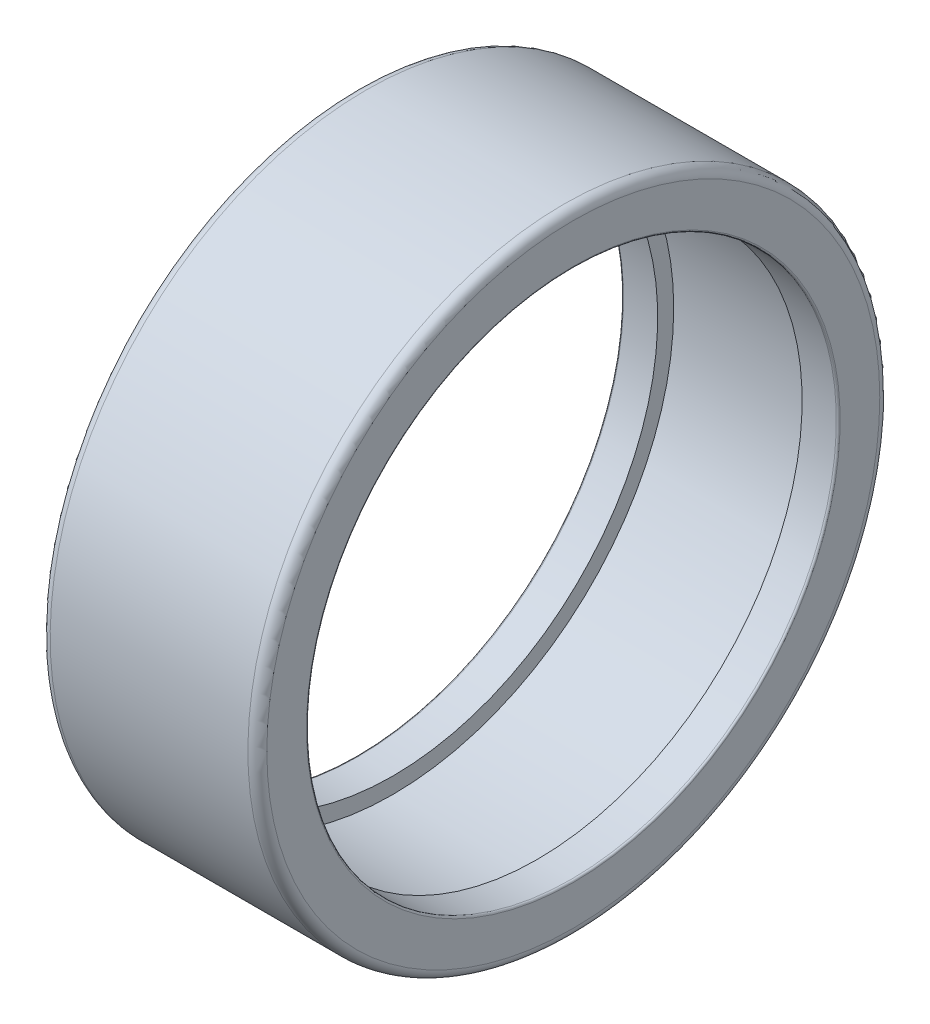
ISO-10303-21;
HEADER;
FILE_DESCRIPTION(('STEP AP214'),'2;1');
FILE_NAME('part.step','',(''),(''),'','','');
FILE_SCHEMA(('AUTOMOTIVE_DESIGN { 1 0 10303 214 1 1 1 1 }'));
ENDSEC;
DATA;
#1=APPLICATION_CONTEXT('core data for automotive mechanical design processes');
#2=APPLICATION_PROTOCOL_DEFINITION('international standard','automotive_design',2000,#1);
#3=PRODUCT_CONTEXT('',#1,'mechanical');
#4=PRODUCT('Part','Part','',(#3));
#5=PRODUCT_RELATED_PRODUCT_CATEGORY('part','',(#4));
#6=PRODUCT_DEFINITION_FORMATION('','',#4);
#7=PRODUCT_DEFINITION_CONTEXT('part definition',#1,'design');
#8=PRODUCT_DEFINITION('design','',#6,#7);
#9=PRODUCT_DEFINITION_SHAPE('','',#8);
#10=(LENGTH_UNIT() NAMED_UNIT(*) SI_UNIT(.MILLI.,.METRE.));
#11=(NAMED_UNIT(*) PLANE_ANGLE_UNIT() SI_UNIT($,.RADIAN.));
#12=(NAMED_UNIT(*) SI_UNIT($,.STERADIAN.) SOLID_ANGLE_UNIT());
#13=UNCERTAINTY_MEASURE_WITH_UNIT(LENGTH_MEASURE(1.E-05),#10,'distance_accuracy_value','');
#14=(GEOMETRIC_REPRESENTATION_CONTEXT(3) GLOBAL_UNCERTAINTY_ASSIGNED_CONTEXT((#13)) GLOBAL_UNIT_ASSIGNED_CONTEXT((#10,
#11,#12)) REPRESENTATION_CONTEXT('',''));
#15=CARTESIAN_POINT('',(0.,0.,0.));
#16=DIRECTION('',(0.,0.,1.));
#17=DIRECTION('',(1.,0.,0.));
#18=AXIS2_PLACEMENT_3D('',#15,#16,#17);
#19=CARTESIAN_POINT('',(47.58,0.,0.));
#20=DIRECTION('',(1.,0.,0.));
#21=DIRECTION('',(0.,0.,-1.));
#22=AXIS2_PLACEMENT_3D('',#19,#20,#21);
#23=TOROIDAL_SURFACE('',#22,59.12,0.42);
#24=CARTESIAN_POINT('',(48.,0.,0.));
#25=DIRECTION('',(1.,0.,0.));
#26=DIRECTION('',(0.,1.,0.));
#27=AXIS2_PLACEMENT_3D('',#24,#25,#26);
#28=CIRCLE('',#27,59.12);
#29=CARTESIAN_POINT('',(48.,59.12,0.));
#30=VERTEX_POINT('',#29);
#31=EDGE_CURVE('E11',#30,#30,#28,.T.);
#32=ORIENTED_EDGE('',*,*,#31,.T.);
#33=EDGE_LOOP('',(#32));
#34=FACE_BOUND('',#33,.T.);
#35=CARTESIAN_POINT('',(47.58,0.,0.));
#36=DIRECTION('',(1.,0.,0.));
#37=DIRECTION('',(0.,1.,0.));
#38=AXIS2_PLACEMENT_3D('',#35,#36,#37);
#39=CIRCLE('',#38,58.7);
#40=CARTESIAN_POINT('',(47.58,58.7,0.));
#41=VERTEX_POINT('',#40);
#42=EDGE_CURVE('E65',#41,#41,#39,.T.);
#43=ORIENTED_EDGE('',*,*,#42,.F.);
#44=EDGE_LOOP('',(#43));
#45=FACE_BOUND('',#44,.T.);
#46=ADVANCED_FACE('F19',(#34,#45),#23,.T.);
#47=CARTESIAN_POINT('',(48.,63.51,0.));
#48=DIRECTION('',(1.,0.,0.));
#49=DIRECTION('',(0.,1.,0.));
#50=AXIS2_PLACEMENT_3D('',#47,#48,#49);
#51=PLANE('',#50);
#52=CARTESIAN_POINT('',(48.,0.,0.));
#53=DIRECTION('',(1.,0.,0.));
#54=DIRECTION('',(0.,1.,0.));
#55=AXIS2_PLACEMENT_3D('',#52,#53,#54);
#56=CIRCLE('',#55,67.9);
#57=CARTESIAN_POINT('',(48.,67.9,0.));
#58=VERTEX_POINT('',#57);
#59=EDGE_CURVE('E29',#58,#58,#56,.T.);
#60=ORIENTED_EDGE('',*,*,#59,.T.);
#61=EDGE_LOOP('',(#60));
#62=FACE_BOUND('',#61,.T.);
#63=ORIENTED_EDGE('',*,*,#31,.F.);
#64=EDGE_LOOP('',(#63));
#65=FACE_BOUND('',#64,.T.);
#66=ADVANCED_FACE('F110',(#62,#65),#51,.T.);
#67=CARTESIAN_POINT('',(45.9,0.,0.));
#68=DIRECTION('',(1.,0.,0.));
#69=DIRECTION('',(0.,0.,-1.));
#70=AXIS2_PLACEMENT_3D('',#67,#68,#69);
#71=TOROIDAL_SURFACE('',#70,67.9,2.1);
#72=CARTESIAN_POINT('',(45.9,0.,0.));
#73=DIRECTION('',(1.,0.,0.));
#74=DIRECTION('',(0.,1.,0.));
#75=AXIS2_PLACEMENT_3D('',#72,#73,#74);
#76=CIRCLE('',#75,70.);
#77=CARTESIAN_POINT('',(45.9,70.,0.));
#78=VERTEX_POINT('',#77);
#79=EDGE_CURVE('E79',#78,#78,#76,.T.);
#80=ORIENTED_EDGE('',*,*,#79,.T.);
#81=EDGE_LOOP('',(#80));
#82=FACE_BOUND('',#81,.T.);
#83=ORIENTED_EDGE('',*,*,#59,.F.);
#84=EDGE_LOOP('',(#83));
#85=FACE_BOUND('',#84,.T.);
#86=ADVANCED_FACE('F114',(#82,#85),#71,.T.);
#87=CARTESIAN_POINT('',(24.,0.,0.));
#88=DIRECTION('',(-1.,0.,0.));
#89=DIRECTION('',(0.,1.,0.));
#90=AXIS2_PLACEMENT_3D('',#87,#88,#89);
#91=CYLINDRICAL_SURFACE('',#90,70.);
#92=CARTESIAN_POINT('',(2.1,0.,0.));
#93=DIRECTION('',(1.,0.,0.));
#94=DIRECTION('',(0.,1.,0.));
#95=AXIS2_PLACEMENT_3D('',#92,#93,#94);
#96=CIRCLE('',#95,70.);
#97=CARTESIAN_POINT('',(2.1,70.,0.));
#98=VERTEX_POINT('',#97);
#99=EDGE_CURVE('E78',#98,#98,#96,.T.);
#100=ORIENTED_EDGE('',*,*,#99,.T.);
#101=EDGE_LOOP('',(#100));
#102=FACE_BOUND('',#101,.T.);
#103=ORIENTED_EDGE('',*,*,#79,.F.);
#104=EDGE_LOOP('',(#103));
#105=FACE_BOUND('',#104,.T.);
#106=ADVANCED_FACE('F105',(#102,#105),#91,.T.);
#107=CARTESIAN_POINT('',(2.1,0.,0.));
#108=DIRECTION('',(1.,0.,0.));
#109=DIRECTION('',(0.,0.,-1.));
#110=AXIS2_PLACEMENT_3D('',#107,#108,#109);
#111=TOROIDAL_SURFACE('',#110,67.9,2.1);
#112=CARTESIAN_POINT('',(0.,0.,0.));
#113=DIRECTION('',(1.,0.,0.));
#114=DIRECTION('',(0.,1.,0.));
#115=AXIS2_PLACEMENT_3D('',#112,#113,#114);
#116=CIRCLE('',#115,67.9);
#117=CARTESIAN_POINT('',(0.,67.9,0.));
#118=VERTEX_POINT('',#117);
#119=EDGE_CURVE('E23',#118,#118,#116,.T.);
#120=ORIENTED_EDGE('',*,*,#119,.T.);
#121=EDGE_LOOP('',(#120));
#122=FACE_BOUND('',#121,.T.);
#123=ORIENTED_EDGE('',*,*,#99,.F.);
#124=EDGE_LOOP('',(#123));
#125=FACE_BOUND('',#124,.T.);
#126=ADVANCED_FACE('F90',(#122,#125),#111,.T.);
#127=CARTESIAN_POINT('',(0.,63.51,0.));
#128=DIRECTION('',(-1.,0.,0.));
#129=DIRECTION('',(0.,-1.,0.));
#130=AXIS2_PLACEMENT_3D('',#127,#128,#129);
#131=PLANE('',#130);
#132=CARTESIAN_POINT('',(0.,0.,0.));
#133=DIRECTION('',(1.,0.,0.));
#134=DIRECTION('',(0.,1.,0.));
#135=AXIS2_PLACEMENT_3D('',#132,#133,#134);
#136=CIRCLE('',#135,59.12);
#137=CARTESIAN_POINT('',(0.,59.12,0.));
#138=VERTEX_POINT('',#137);
#139=EDGE_CURVE('E85',#138,#138,#136,.T.);
#140=ORIENTED_EDGE('',*,*,#139,.T.);
#141=EDGE_LOOP('',(#140));
#142=FACE_BOUND('',#141,.T.);
#143=ORIENTED_EDGE('',*,*,#119,.F.);
#144=EDGE_LOOP('',(#143));
#145=FACE_BOUND('',#144,.T.);
#146=ADVANCED_FACE('F93',(#142,#145),#131,.T.);
#147=CARTESIAN_POINT('',(0.42,0.,0.));
#148=DIRECTION('',(1.,0.,0.));
#149=DIRECTION('',(0.,0.,-1.));
#150=AXIS2_PLACEMENT_3D('',#147,#148,#149);
#151=TOROIDAL_SURFACE('',#150,59.12,0.42);
#152=CARTESIAN_POINT('',(0.42,0.,0.));
#153=DIRECTION('',(1.,0.,0.));
#154=DIRECTION('',(0.,1.,0.));
#155=AXIS2_PLACEMENT_3D('',#152,#153,#154);
#156=CIRCLE('',#155,58.7);
#157=CARTESIAN_POINT('',(0.42,58.7,0.));
#158=VERTEX_POINT('',#157);
#159=EDGE_CURVE('E77',#158,#158,#156,.T.);
#160=ORIENTED_EDGE('',*,*,#159,.T.);
#161=EDGE_LOOP('',(#160));
#162=FACE_BOUND('',#161,.T.);
#163=ORIENTED_EDGE('',*,*,#139,.F.);
#164=EDGE_LOOP('',(#163));
#165=FACE_BOUND('',#164,.T.);
#166=ADVANCED_FACE('F95',(#162,#165),#151,.T.);
#167=CARTESIAN_POINT('',(4.21,0.,0.));
#168=DIRECTION('',(-1.,0.,0.));
#169=DIRECTION('',(0.,1.,0.));
#170=AXIS2_PLACEMENT_3D('',#167,#168,#169);
#171=CYLINDRICAL_SURFACE('',#170,58.7);
#172=CARTESIAN_POINT('',(8.,0.,0.));
#173=DIRECTION('',(1.,0.,0.));
#174=DIRECTION('',(0.,1.,0.));
#175=AXIS2_PLACEMENT_3D('',#172,#173,#174);
#176=CIRCLE('',#175,58.7);
#177=CARTESIAN_POINT('',(8.,58.7,0.));
#178=VERTEX_POINT('',#177);
#179=EDGE_CURVE('E75',#178,#178,#176,.T.);
#180=ORIENTED_EDGE('',*,*,#179,.T.);
#181=EDGE_LOOP('',(#180));
#182=FACE_BOUND('',#181,.T.);
#183=ORIENTED_EDGE('',*,*,#159,.F.);
#184=EDGE_LOOP('',(#183));
#185=FACE_BOUND('',#184,.T.);
#186=ADVANCED_FACE('F102',(#182,#185),#171,.F.);
#187=CARTESIAN_POINT('',(8.,60.475,0.));
#188=DIRECTION('',(1.,0.,0.));
#189=DIRECTION('',(0.,1.,0.));
#190=AXIS2_PLACEMENT_3D('',#187,#188,#189);
#191=PLANE('',#190);
#192=CARTESIAN_POINT('',(8.,0.,0.));
#193=DIRECTION('',(1.,0.,0.));
#194=DIRECTION('',(0.,1.,0.));
#195=AXIS2_PLACEMENT_3D('',#192,#193,#194);
#196=CIRCLE('',#195,62.25);
#197=CARTESIAN_POINT('',(8.,62.25,0.));
#198=VERTEX_POINT('',#197);
#199=EDGE_CURVE('E71',#198,#198,#196,.T.);
#200=ORIENTED_EDGE('',*,*,#199,.T.);
#201=EDGE_LOOP('',(#200));
#202=FACE_BOUND('',#201,.T.);
#203=ORIENTED_EDGE('',*,*,#179,.F.);
#204=EDGE_LOOP('',(#203));
#205=FACE_BOUND('',#204,.T.);
#206=ADVANCED_FACE('F118',(#202,#205),#191,.T.);
#207=CARTESIAN_POINT('',(24.,0.,0.));
#208=DIRECTION('',(-1.,0.,0.));
#209=DIRECTION('',(0.,1.,0.));
#210=AXIS2_PLACEMENT_3D('',#207,#208,#209);
#211=CYLINDRICAL_SURFACE('',#210,62.25);
#212=CARTESIAN_POINT('',(40.,0.,0.));
#213=DIRECTION('',(1.,0.,0.));
#214=DIRECTION('',(0.,1.,0.));
#215=AXIS2_PLACEMENT_3D('',#212,#213,#214);
#216=CIRCLE('',#215,62.25);
#217=CARTESIAN_POINT('',(40.,62.25,0.));
#218=VERTEX_POINT('',#217);
#219=EDGE_CURVE('E68',#218,#218,#216,.T.);
#220=ORIENTED_EDGE('',*,*,#219,.T.);
#221=EDGE_LOOP('',(#220));
#222=FACE_BOUND('',#221,.T.);
#223=ORIENTED_EDGE('',*,*,#199,.F.);
#224=EDGE_LOOP('',(#223));
#225=FACE_BOUND('',#224,.T.);
#226=ADVANCED_FACE('F121',(#222,#225),#211,.F.);
#227=CARTESIAN_POINT('',(40.,60.475,0.));
#228=DIRECTION('',(-1.,0.,0.));
#229=DIRECTION('',(0.,-1.,0.));
#230=AXIS2_PLACEMENT_3D('',#227,#228,#229);
#231=PLANE('',#230);
#232=CARTESIAN_POINT('',(40.,0.,0.));
#233=DIRECTION('',(1.,0.,0.));
#234=DIRECTION('',(0.,1.,0.));
#235=AXIS2_PLACEMENT_3D('',#232,#233,#234);
#236=CIRCLE('',#235,58.7);
#237=CARTESIAN_POINT('',(40.,58.7,0.));
#238=VERTEX_POINT('',#237);
#239=EDGE_CURVE('E69',#238,#238,#236,.T.);
#240=ORIENTED_EDGE('',*,*,#239,.T.);
#241=EDGE_LOOP('',(#240));
#242=FACE_BOUND('',#241,.T.);
#243=ORIENTED_EDGE('',*,*,#219,.F.);
#244=EDGE_LOOP('',(#243));
#245=FACE_BOUND('',#244,.T.);
#246=ADVANCED_FACE('F126',(#242,#245),#231,.T.);
#247=CARTESIAN_POINT('',(43.79,0.,0.));
#248=DIRECTION('',(-1.,0.,0.));
#249=DIRECTION('',(0.,1.,0.));
#250=AXIS2_PLACEMENT_3D('',#247,#248,#249);
#251=CYLINDRICAL_SURFACE('',#250,58.7);
#252=ORIENTED_EDGE('',*,*,#42,.T.);
#253=EDGE_LOOP('',(#252));
#254=FACE_BOUND('',#253,.T.);
#255=ORIENTED_EDGE('',*,*,#239,.F.);
#256=EDGE_LOOP('',(#255));
#257=FACE_BOUND('',#256,.T.);
#258=ADVANCED_FACE('F21',(#254,#257),#251,.F.);
#259=CLOSED_SHELL('',(#46,#66,#86,#106,#126,#146,#166,#186,#206,#226,#246,#258));
#260=MANIFOLD_SOLID_BREP('B1',#259);
#261=ADVANCED_BREP_SHAPE_REPRESENTATION('',(#18,#260),#14);
#262=SHAPE_DEFINITION_REPRESENTATION(#9,#261);
ENDSEC;
END-ISO-10303-21;
